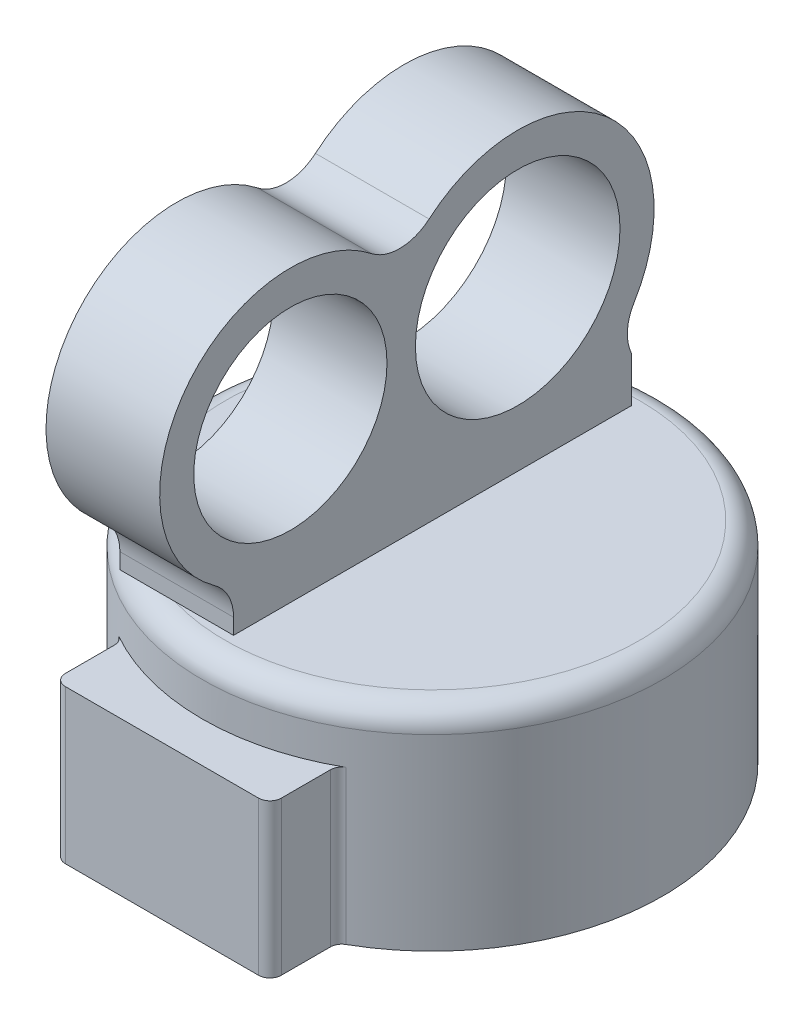
ISO-10303-21;
HEADER;
FILE_DESCRIPTION(('STEP AP214'),'2;1');
FILE_NAME('part.step','',(''),(''),'','','');
FILE_SCHEMA(('AUTOMOTIVE_DESIGN { 1 0 10303 214 1 1 1 1 }'));
ENDSEC;
DATA;
#1=APPLICATION_CONTEXT('core data for automotive mechanical design processes');
#2=APPLICATION_PROTOCOL_DEFINITION('international standard','automotive_design',2000,#1);
#3=PRODUCT_CONTEXT('',#1,'mechanical');
#4=PRODUCT('Part','Part','',(#3));
#5=PRODUCT_RELATED_PRODUCT_CATEGORY('part','',(#4));
#6=PRODUCT_DEFINITION_FORMATION('','',#4);
#7=PRODUCT_DEFINITION_CONTEXT('part definition',#1,'design');
#8=PRODUCT_DEFINITION('design','',#6,#7);
#9=PRODUCT_DEFINITION_SHAPE('','',#8);
#10=(LENGTH_UNIT() NAMED_UNIT(*) SI_UNIT(.MILLI.,.METRE.));
#11=(NAMED_UNIT(*) PLANE_ANGLE_UNIT() SI_UNIT($,.RADIAN.));
#12=(NAMED_UNIT(*) SI_UNIT($,.STERADIAN.) SOLID_ANGLE_UNIT());
#13=UNCERTAINTY_MEASURE_WITH_UNIT(LENGTH_MEASURE(1.E-05),#10,'distance_accuracy_value','');
#14=(GEOMETRIC_REPRESENTATION_CONTEXT(3) GLOBAL_UNCERTAINTY_ASSIGNED_CONTEXT((#13)) GLOBAL_UNIT_ASSIGNED_CONTEXT((#10,
#11,#12)) REPRESENTATION_CONTEXT('',''));
#15=CARTESIAN_POINT('',(0.,0.,0.));
#16=DIRECTION('',(0.,0.,1.));
#17=DIRECTION('',(1.,0.,0.));
#18=AXIS2_PLACEMENT_3D('',#15,#16,#17);
#19=CARTESIAN_POINT('',(0.,18.5,0.));
#20=DIRECTION('',(0.,-1.,0.));
#21=DIRECTION('',(0.,0.,-1.));
#22=AXIS2_PLACEMENT_3D('',#19,#20,#21);
#23=PLANE('',#22);
#24=DIRECTION('',(0.,0.,1.));
#25=VECTOR('',#24,1.);
#26=CARTESIAN_POINT('',(-10.,18.5,17.5));
#27=LINE('',#26,#25);
#28=CARTESIAN_POINT('',(-10.,18.5,-15.266384640772));
#29=VERTEX_POINT('',#28);
#30=CARTESIAN_POINT('',(-10.,18.5,15.266384640772));
#31=VERTEX_POINT('',#30);
#32=EDGE_CURVE('E298',#29,#31,#27,.T.);
#33=ORIENTED_EDGE('',*,*,#32,.F.);
#34=CARTESIAN_POINT('',(0.,18.5,0.));
#35=DIRECTION('',(0.,-1.,0.));
#36=DIRECTION('',(0.,0.,-1.));
#37=AXIS2_PLACEMENT_3D('',#34,#35,#36);
#38=CIRCLE('',#37,18.25);
#39=EDGE_CURVE('E43',#29,#31,#38,.F.);
#40=ORIENTED_EDGE('',*,*,#39,.T.);
#41=EDGE_LOOP('',(#33,#40));
#42=FACE_BOUND('',#41,.T.);
#43=ADVANCED_FACE('F35',(#42),#23,.F.);
#44=CARTESIAN_POINT('',(-10.5,0.,18.4746447868423));
#45=DIRECTION('',(0.,1.,0.));
#46=DIRECTION('',(0.,0.,1.));
#47=AXIS2_PLACEMENT_3D('',#44,#45,#46);
#48=PLANE('',#47);
#49=CARTESIAN_POINT('',(-10.5,0.,18.4746447868423));
#50=DIRECTION('',(0.,-1.,0.));
#51=DIRECTION('',(0.,0.,1.));
#52=AXIS2_PLACEMENT_3D('',#49,#50,#51);
#53=CIRCLE('',#52,1.);
#54=CARTESIAN_POINT('',(-10.0058823529412,0.,17.6052497380497));
#55=VERTEX_POINT('',#54);
#56=CARTESIAN_POINT('',(-9.5,0.,18.4746447868423));
#57=VERTEX_POINT('',#56);
#58=EDGE_CURVE('E247',#55,#57,#53,.T.);
#59=ORIENTED_EDGE('',*,*,#58,.F.);
#60=CARTESIAN_POINT('',(0.,0.,0.));
#61=DIRECTION('',(0.,1.,0.));
#62=DIRECTION('',(0.,0.,1.));
#63=AXIS2_PLACEMENT_3D('',#60,#61,#62);
#64=CIRCLE('',#63,20.25);
#65=CARTESIAN_POINT('',(10.0058823529412,0.,17.6052497380497));
#66=VERTEX_POINT('',#65);
#67=EDGE_CURVE('E268',#66,#55,#64,.T.);
#68=ORIENTED_EDGE('',*,*,#67,.F.);
#69=CARTESIAN_POINT('',(10.5,0.,18.4746447868423));
#70=DIRECTION('',(0.,-1.,0.));
#71=DIRECTION('',(0.,0.,1.));
#72=AXIS2_PLACEMENT_3D('',#69,#70,#71);
#73=CIRCLE('',#72,1.);
#74=CARTESIAN_POINT('',(9.5,0.,18.4746447868423));
#75=VERTEX_POINT('',#74);
#76=EDGE_CURVE('E265',#75,#66,#73,.T.);
#77=ORIENTED_EDGE('',*,*,#76,.F.);
#78=DIRECTION('',(0.,0.,-1.));
#79=VECTOR('',#78,1.);
#80=CARTESIAN_POINT('',(9.5,0.,22.8));
#81=LINE('',#80,#79);
#82=CARTESIAN_POINT('',(9.5,0.,22.8));
#83=VERTEX_POINT('',#82);
#84=EDGE_CURVE('E262',#83,#75,#81,.T.);
#85=ORIENTED_EDGE('',*,*,#84,.F.);
#86=CARTESIAN_POINT('',(8.5,0.,22.8));
#87=DIRECTION('',(0.,1.,0.));
#88=DIRECTION('',(0.,0.,1.));
#89=AXIS2_PLACEMENT_3D('',#86,#87,#88);
#90=CIRCLE('',#89,1.);
#91=CARTESIAN_POINT('',(8.5,0.,23.8));
#92=VERTEX_POINT('',#91);
#93=EDGE_CURVE('E259',#92,#83,#90,.T.);
#94=ORIENTED_EDGE('',*,*,#93,.F.);
#95=DIRECTION('',(1.,0.,0.));
#96=VECTOR('',#95,1.);
#97=CARTESIAN_POINT('',(8.5,0.,23.8));
#98=LINE('',#97,#96);
#99=CARTESIAN_POINT('',(-8.5,0.,23.8));
#100=VERTEX_POINT('',#99);
#101=EDGE_CURVE('E256',#100,#92,#98,.T.);
#102=ORIENTED_EDGE('',*,*,#101,.F.);
#103=CARTESIAN_POINT('',(-8.5,0.,22.8));
#104=DIRECTION('',(0.,1.,0.));
#105=DIRECTION('',(0.,0.,1.));
#106=AXIS2_PLACEMENT_3D('',#103,#104,#105);
#107=CIRCLE('',#106,1.);
#108=CARTESIAN_POINT('',(-9.5,0.,22.8));
#109=VERTEX_POINT('',#108);
#110=EDGE_CURVE('E253',#109,#100,#107,.T.);
#111=ORIENTED_EDGE('',*,*,#110,.F.);
#112=DIRECTION('',(0.,0.,1.));
#113=VECTOR('',#112,1.);
#114=CARTESIAN_POINT('',(-9.5,0.,18.4746447868423));
#115=LINE('',#114,#113);
#116=EDGE_CURVE('E250',#57,#109,#115,.T.);
#117=ORIENTED_EDGE('',*,*,#116,.F.);
#118=EDGE_LOOP('',(#59,#68,#77,#85,#94,#102,#111,#117));
#119=FACE_BOUND('',#118,.T.);
#120=ADVANCED_FACE('F336',(#119),#48,.F.);
#121=CARTESIAN_POINT('',(0.,73.3385536255682,0.));
#122=DIRECTION('',(0.,-1.,0.));
#123=DIRECTION('',(0.,0.,-1.));
#124=AXIS2_PLACEMENT_3D('',#121,#122,#123);
#125=CYLINDRICAL_SURFACE('',#124,20.25);
#126=CARTESIAN_POINT('',(0.,16.5,0.));
#127=DIRECTION('',(0.,-1.,0.));
#128=DIRECTION('',(0.,0.,-1.));
#129=AXIS2_PLACEMENT_3D('',#126,#127,#128);
#130=CIRCLE('',#129,20.25);
#131=CARTESIAN_POINT('',(0.,16.5,-20.25));
#132=VERTEX_POINT('',#131);
#133=EDGE_CURVE('E224',#132,#132,#130,.T.);
#134=ORIENTED_EDGE('',*,*,#133,.T.);
#135=EDGE_LOOP('',(#134));
#136=FACE_BOUND('',#135,.T.);
#137=DIRECTION('',(0.,-1.,0.));
#138=VECTOR('',#137,1.);
#139=CARTESIAN_POINT('',(-10.0058823529412,73.3385536255682,17.6052497380497));
#140=LINE('',#139,#138);
#141=CARTESIAN_POINT('',(-10.0058823529412,13.5,17.6052497380497));
#142=VERTEX_POINT('',#141);
#143=EDGE_CURVE('E271',#142,#55,#140,.T.);
#144=ORIENTED_EDGE('',*,*,#143,.F.);
#145=CARTESIAN_POINT('',(0.,13.5,0.));
#146=DIRECTION('',(0.,1.,0.));
#147=DIRECTION('',(0.,0.,1.));
#148=AXIS2_PLACEMENT_3D('',#145,#146,#147);
#149=CIRCLE('',#148,20.25);
#150=CARTESIAN_POINT('',(10.0058823529412,13.5,17.6052497380497));
#151=VERTEX_POINT('',#150);
#152=EDGE_CURVE('E221',#142,#151,#149,.T.);
#153=ORIENTED_EDGE('',*,*,#152,.T.);
#154=DIRECTION('',(0.,-1.,0.));
#155=VECTOR('',#154,1.);
#156=CARTESIAN_POINT('',(10.0058823529412,73.3385536255682,17.6052497380497));
#157=LINE('',#156,#155);
#158=EDGE_CURVE('E273',#151,#66,#157,.T.);
#159=ORIENTED_EDGE('',*,*,#158,.T.);
#160=ORIENTED_EDGE('',*,*,#67,.T.);
#161=EDGE_LOOP('',(#144,#153,#159,#160));
#162=FACE_BOUND('',#161,.T.);
#163=ADVANCED_FACE('F342',(#136,#162),#125,.T.);
#164=CARTESIAN_POINT('',(10.5,73.3385536255682,18.4746447868423));
#165=DIRECTION('',(0.,-1.,0.));
#166=DIRECTION('',(0.,0.,-1.));
#167=AXIS2_PLACEMENT_3D('',#164,#165,#166);
#168=CYLINDRICAL_SURFACE('',#167,1.);
#169=ORIENTED_EDGE('',*,*,#158,.F.);
#170=CARTESIAN_POINT('',(10.5,13.5,18.4746447868423));
#171=DIRECTION('',(0.,-1.,0.));
#172=DIRECTION('',(0.,0.,-1.));
#173=AXIS2_PLACEMENT_3D('',#170,#171,#172);
#174=CIRCLE('',#173,1.);
#175=CARTESIAN_POINT('',(9.5,13.5,18.4746447868423));
#176=VERTEX_POINT('',#175);
#177=EDGE_CURVE('E226',#151,#176,#174,.F.);
#178=ORIENTED_EDGE('',*,*,#177,.T.);
#179=DIRECTION('',(0.,-1.,0.));
#180=VECTOR('',#179,1.);
#181=CARTESIAN_POINT('',(9.5,73.3385536255682,18.4746447868423));
#182=LINE('',#181,#180);
#183=EDGE_CURVE('E275',#176,#75,#182,.T.);
#184=ORIENTED_EDGE('',*,*,#183,.T.);
#185=ORIENTED_EDGE('',*,*,#76,.T.);
#186=EDGE_LOOP('',(#169,#178,#184,#185));
#187=FACE_BOUND('',#186,.T.);
#188=ADVANCED_FACE('F364',(#187),#168,.F.);
#189=CARTESIAN_POINT('',(9.5,73.3385536255682,22.8));
#190=DIRECTION('',(-1.,0.,0.));
#191=DIRECTION('',(0.,0.,1.));
#192=AXIS2_PLACEMENT_3D('',#189,#190,#191);
#193=PLANE('',#192);
#194=ORIENTED_EDGE('',*,*,#183,.F.);
#195=DIRECTION('',(0.,0.,1.));
#196=VECTOR('',#195,1.);
#197=CARTESIAN_POINT('',(9.5,13.5,22.8));
#198=LINE('',#197,#196);
#199=CARTESIAN_POINT('',(9.5,13.5,22.8));
#200=VERTEX_POINT('',#199);
#201=EDGE_CURVE('E229',#176,#200,#198,.T.);
#202=ORIENTED_EDGE('',*,*,#201,.T.);
#203=DIRECTION('',(0.,-1.,0.));
#204=VECTOR('',#203,1.);
#205=CARTESIAN_POINT('',(9.5,73.3385536255682,22.8));
#206=LINE('',#205,#204);
#207=EDGE_CURVE('E277',#200,#83,#206,.T.);
#208=ORIENTED_EDGE('',*,*,#207,.T.);
#209=ORIENTED_EDGE('',*,*,#84,.T.);
#210=EDGE_LOOP('',(#194,#202,#208,#209));
#211=FACE_BOUND('',#210,.T.);
#212=ADVANCED_FACE('F367',(#211),#193,.F.);
#213=CARTESIAN_POINT('',(8.5,73.3385536255682,22.8));
#214=DIRECTION('',(0.,-1.,0.));
#215=DIRECTION('',(0.,0.,-1.));
#216=AXIS2_PLACEMENT_3D('',#213,#214,#215);
#217=CYLINDRICAL_SURFACE('',#216,1.);
#218=ORIENTED_EDGE('',*,*,#207,.F.);
#219=CARTESIAN_POINT('',(8.5,13.5,22.8));
#220=DIRECTION('',(0.,-1.,0.));
#221=DIRECTION('',(0.,0.,-1.));
#222=AXIS2_PLACEMENT_3D('',#219,#220,#221);
#223=CIRCLE('',#222,1.);
#224=CARTESIAN_POINT('',(8.5,13.5,23.8));
#225=VERTEX_POINT('',#224);
#226=EDGE_CURVE('E233',#200,#225,#223,.T.);
#227=ORIENTED_EDGE('',*,*,#226,.T.);
#228=DIRECTION('',(0.,-1.,0.));
#229=VECTOR('',#228,1.);
#230=CARTESIAN_POINT('',(8.5,73.3385536255682,23.8));
#231=LINE('',#230,#229);
#232=EDGE_CURVE('E279',#225,#92,#231,.T.);
#233=ORIENTED_EDGE('',*,*,#232,.T.);
#234=ORIENTED_EDGE('',*,*,#93,.T.);
#235=EDGE_LOOP('',(#218,#227,#233,#234));
#236=FACE_BOUND('',#235,.T.);
#237=ADVANCED_FACE('F371',(#236),#217,.T.);
#238=CARTESIAN_POINT('',(8.5,73.3385536255682,23.8));
#239=DIRECTION('',(0.,0.,-1.));
#240=DIRECTION('',(-1.,0.,0.));
#241=AXIS2_PLACEMENT_3D('',#238,#239,#240);
#242=PLANE('',#241);
#243=ORIENTED_EDGE('',*,*,#232,.F.);
#244=DIRECTION('',(-1.,0.,0.));
#245=VECTOR('',#244,1.);
#246=CARTESIAN_POINT('',(8.5,13.5,23.8));
#247=LINE('',#246,#245);
#248=CARTESIAN_POINT('',(-8.49999999999999,13.5,23.8));
#249=VERTEX_POINT('',#248);
#250=EDGE_CURVE('E236',#225,#249,#247,.T.);
#251=ORIENTED_EDGE('',*,*,#250,.T.);
#252=DIRECTION('',(0.,-1.,0.));
#253=VECTOR('',#252,1.);
#254=CARTESIAN_POINT('',(-8.5,73.3385536255682,23.8));
#255=LINE('',#254,#253);
#256=EDGE_CURVE('E281',#249,#100,#255,.T.);
#257=ORIENTED_EDGE('',*,*,#256,.T.);
#258=ORIENTED_EDGE('',*,*,#101,.T.);
#259=EDGE_LOOP('',(#243,#251,#257,#258));
#260=FACE_BOUND('',#259,.T.);
#261=ADVANCED_FACE('F375',(#260),#242,.F.);
#262=CARTESIAN_POINT('',(-8.5,73.3385536255682,22.8));
#263=DIRECTION('',(0.,-1.,0.));
#264=DIRECTION('',(0.,0.,-1.));
#265=AXIS2_PLACEMENT_3D('',#262,#263,#264);
#266=CYLINDRICAL_SURFACE('',#265,1.);
#267=ORIENTED_EDGE('',*,*,#256,.F.);
#268=CARTESIAN_POINT('',(-8.5,13.5,22.8));
#269=DIRECTION('',(0.,-1.,0.));
#270=DIRECTION('',(0.,0.,-1.));
#271=AXIS2_PLACEMENT_3D('',#268,#269,#270);
#272=CIRCLE('',#271,1.);
#273=CARTESIAN_POINT('',(-9.5,13.5,22.8));
#274=VERTEX_POINT('',#273);
#275=EDGE_CURVE('E239',#249,#274,#272,.T.);
#276=ORIENTED_EDGE('',*,*,#275,.T.);
#277=DIRECTION('',(0.,-1.,0.));
#278=VECTOR('',#277,1.);
#279=CARTESIAN_POINT('',(-9.5,73.3385536255682,22.8));
#280=LINE('',#279,#278);
#281=EDGE_CURVE('E283',#274,#109,#280,.T.);
#282=ORIENTED_EDGE('',*,*,#281,.T.);
#283=ORIENTED_EDGE('',*,*,#110,.T.);
#284=EDGE_LOOP('',(#267,#276,#282,#283));
#285=FACE_BOUND('',#284,.T.);
#286=ADVANCED_FACE('F379',(#285),#266,.T.);
#287=CARTESIAN_POINT('',(-9.5,73.3385536255682,18.4746447868423));
#288=DIRECTION('',(1.,0.,0.));
#289=DIRECTION('',(0.,0.,-1.));
#290=AXIS2_PLACEMENT_3D('',#287,#288,#289);
#291=PLANE('',#290);
#292=ORIENTED_EDGE('',*,*,#281,.F.);
#293=DIRECTION('',(0.,0.,-1.));
#294=VECTOR('',#293,1.);
#295=CARTESIAN_POINT('',(-9.5,13.5,18.4746447868423));
#296=LINE('',#295,#294);
#297=CARTESIAN_POINT('',(-9.5,13.5,18.4746447868423));
#298=VERTEX_POINT('',#297);
#299=EDGE_CURVE('E242',#274,#298,#296,.T.);
#300=ORIENTED_EDGE('',*,*,#299,.T.);
#301=DIRECTION('',(0.,-1.,0.));
#302=VECTOR('',#301,1.);
#303=CARTESIAN_POINT('',(-9.5,73.3385536255682,18.4746447868423));
#304=LINE('',#303,#302);
#305=EDGE_CURVE('E230',#298,#57,#304,.T.);
#306=ORIENTED_EDGE('',*,*,#305,.T.);
#307=ORIENTED_EDGE('',*,*,#116,.T.);
#308=EDGE_LOOP('',(#292,#300,#306,#307));
#309=FACE_BOUND('',#308,.T.);
#310=ADVANCED_FACE('F359',(#309),#291,.F.);
#311=CARTESIAN_POINT('',(-10.5,73.3385536255682,18.4746447868423));
#312=DIRECTION('',(0.,-1.,0.));
#313=DIRECTION('',(0.,0.,-1.));
#314=AXIS2_PLACEMENT_3D('',#311,#312,#313);
#315=CYLINDRICAL_SURFACE('',#314,1.);
#316=ORIENTED_EDGE('',*,*,#305,.F.);
#317=CARTESIAN_POINT('',(-10.5,13.5,18.4746447868423));
#318=DIRECTION('',(0.,-1.,0.));
#319=DIRECTION('',(0.,0.,-1.));
#320=AXIS2_PLACEMENT_3D('',#317,#318,#319);
#321=CIRCLE('',#320,1.);
#322=EDGE_CURVE('E225',#298,#142,#321,.F.);
#323=ORIENTED_EDGE('',*,*,#322,.T.);
#324=ORIENTED_EDGE('',*,*,#143,.T.);
#325=ORIENTED_EDGE('',*,*,#58,.T.);
#326=EDGE_LOOP('',(#316,#323,#324,#325));
#327=FACE_BOUND('',#326,.T.);
#328=ADVANCED_FACE('F354',(#327),#315,.F.);
#329=CARTESIAN_POINT('',(-10.,13.5,-7.5));
#330=DIRECTION('',(0.,-1.,0.));
#331=DIRECTION('',(0.,0.,-1.));
#332=AXIS2_PLACEMENT_3D('',#329,#330,#331);
#333=PLANE('',#332);
#334=ORIENTED_EDGE('',*,*,#152,.F.);
#335=ORIENTED_EDGE('',*,*,#322,.F.);
#336=ORIENTED_EDGE('',*,*,#299,.F.);
#337=ORIENTED_EDGE('',*,*,#275,.F.);
#338=ORIENTED_EDGE('',*,*,#250,.F.);
#339=ORIENTED_EDGE('',*,*,#226,.F.);
#340=ORIENTED_EDGE('',*,*,#201,.F.);
#341=ORIENTED_EDGE('',*,*,#177,.F.);
#342=EDGE_LOOP('',(#334,#335,#336,#337,#338,#339,#340,#341));
#343=FACE_BOUND('',#342,.T.);
#344=ADVANCED_FACE('F348',(#343),#333,.F.);
#345=CARTESIAN_POINT('',(-5.17807879430192,18.5,17.5));
#346=VERTEX_POINT('',#345);
#347=CARTESIAN_POINT('',(-5.17807879430199,18.5,-17.5));
#348=VERTEX_POINT('',#347);
#349=EDGE_CURVE('E44',#346,#348,#38,.F.);
#350=ORIENTED_EDGE('',*,*,#349,.T.);
#351=DIRECTION('',(1.,0.,0.));
#352=VECTOR('',#351,1.);
#353=CARTESIAN_POINT('',(-60.6779044554923,18.5,-17.5));
#354=LINE('',#353,#352);
#355=CARTESIAN_POINT('',(0.,18.5,-17.5));
#356=VERTEX_POINT('',#355);
#357=EDGE_CURVE('E56',#348,#356,#354,.T.);
#358=ORIENTED_EDGE('',*,*,#357,.T.);
#359=DIRECTION('',(0.,0.,-1.));
#360=VECTOR('',#359,1.);
#361=CARTESIAN_POINT('',(0.,18.5,17.5));
#362=LINE('',#361,#360);
#363=CARTESIAN_POINT('',(0.,18.5,17.5));
#364=VERTEX_POINT('',#363);
#365=EDGE_CURVE('E51',#364,#356,#362,.T.);
#366=ORIENTED_EDGE('',*,*,#365,.F.);
#367=DIRECTION('',(1.,0.,0.));
#368=VECTOR('',#367,1.);
#369=CARTESIAN_POINT('',(-60.6779044554923,18.5,17.5));
#370=LINE('',#369,#368);
#371=EDGE_CURVE('E205',#346,#364,#370,.T.);
#372=ORIENTED_EDGE('',*,*,#371,.F.);
#373=EDGE_LOOP('',(#350,#358,#366,#372));
#374=FACE_BOUND('',#373,.T.);
#375=ADVANCED_FACE('F338',(#374),#23,.F.);
#376=CARTESIAN_POINT('',(0.,16.5,0.));
#377=DIRECTION('',(0.,-1.,0.));
#378=DIRECTION('',(0.,0.,-1.));
#379=AXIS2_PLACEMENT_3D('',#376,#377,#378);
#380=TOROIDAL_SURFACE('',#379,18.25,2.);
#381=EDGE_CURVE('E11',#348,#29,#38,.F.);
#382=ORIENTED_EDGE('',*,*,#381,.F.);
#383=ORIENTED_EDGE('',*,*,#349,.F.);
#384=EDGE_CURVE('E288',#31,#346,#38,.F.);
#385=ORIENTED_EDGE('',*,*,#384,.F.);
#386=ORIENTED_EDGE('',*,*,#39,.F.);
#387=EDGE_LOOP('',(#382,#383,#385,#386));
#388=FACE_BOUND('',#387,.T.);
#389=ORIENTED_EDGE('',*,*,#133,.F.);
#390=EDGE_LOOP('',(#389));
#391=FACE_BOUND('',#390,.T.);
#392=ADVANCED_FACE('F37',(#388,#391),#380,.T.);
#393=CARTESIAN_POINT('',(-60.6779044554923,18.5,17.5));
#394=DIRECTION('',(0.,-1.,0.));
#395=DIRECTION('',(0.,0.,-1.));
#396=AXIS2_PLACEMENT_3D('',#393,#394,#395);
#397=PLANE('',#396);
#398=CARTESIAN_POINT('',(-10.,18.5,-17.5));
#399=VERTEX_POINT('',#398);
#400=EDGE_CURVE('E171',#399,#348,#354,.T.);
#401=ORIENTED_EDGE('',*,*,#400,.T.);
#402=ORIENTED_EDGE('',*,*,#381,.T.);
#403=EDGE_CURVE('E306',#399,#29,#27,.T.);
#404=ORIENTED_EDGE('',*,*,#403,.F.);
#405=EDGE_LOOP('',(#401,#402,#404));
#406=FACE_BOUND('',#405,.T.);
#407=ADVANCED_FACE('F353',(#406),#397,.T.);
#408=CARTESIAN_POINT('',(-60.6779044554923,18.5,-17.5));
#409=DIRECTION('',(0.,0.,-1.));
#410=DIRECTION('',(-1.,0.,0.));
#411=AXIS2_PLACEMENT_3D('',#408,#409,#410);
#412=PLANE('',#411);
#413=DIRECTION('',(0.,-1.,0.));
#414=VECTOR('',#413,1.);
#415=CARTESIAN_POINT('',(-10.,18.5,-17.5));
#416=LINE('',#415,#414);
#417=CARTESIAN_POINT('',(-10.,22.5,-17.5));
#418=VERTEX_POINT('',#417);
#419=EDGE_CURVE('E167',#418,#399,#416,.T.);
#420=ORIENTED_EDGE('',*,*,#419,.F.);
#421=DIRECTION('',(1.,0.,0.));
#422=VECTOR('',#421,1.);
#423=CARTESIAN_POINT('',(-60.6779044554923,22.5,-17.5));
#424=LINE('',#423,#422);
#425=CARTESIAN_POINT('',(0.,22.5,-17.5));
#426=VERTEX_POINT('',#425);
#427=EDGE_CURVE('E161',#418,#426,#424,.T.);
#428=ORIENTED_EDGE('',*,*,#427,.T.);
#429=DIRECTION('',(0.,1.,0.));
#430=VECTOR('',#429,1.);
#431=CARTESIAN_POINT('',(0.,18.5,-17.5));
#432=LINE('',#431,#430);
#433=EDGE_CURVE('E165',#356,#426,#432,.T.);
#434=ORIENTED_EDGE('',*,*,#433,.F.);
#435=ORIENTED_EDGE('',*,*,#357,.F.);
#436=ORIENTED_EDGE('',*,*,#400,.F.);
#437=EDGE_LOOP('',(#420,#428,#434,#435,#436));
#438=FACE_BOUND('',#437,.T.);
#439=ADVANCED_FACE('F163',(#438),#412,.T.);
#440=CARTESIAN_POINT('',(-60.6779044554923,24.1457513110646,-21.1457513110646));
#441=DIRECTION('',(1.,0.,0.));
#442=DIRECTION('',(0.,0.,-1.));
#443=AXIS2_PLACEMENT_3D('',#440,#441,#442);
#444=CYLINDRICAL_SURFACE('',#443,4.);
#445=CARTESIAN_POINT('',(-10.,24.1457513110646,-21.1457513110646));
#446=DIRECTION('',(1.,0.,0.));
#447=DIRECTION('',(0.,0.,-1.));
#448=AXIS2_PLACEMENT_3D('',#445,#446,#447);
#449=CIRCLE('',#448,4.);
#450=CARTESIAN_POINT('',(-10.,26.2343134832984,-17.7343134832984));
#451=VERTEX_POINT('',#450);
#452=EDGE_CURVE('E204',#451,#418,#449,.T.);
#453=ORIENTED_EDGE('',*,*,#452,.F.);
#454=DIRECTION('',(1.,0.,0.));
#455=VECTOR('',#454,1.);
#456=CARTESIAN_POINT('',(-60.6779044554923,26.2343134832984,-17.7343134832984));
#457=LINE('',#456,#455);
#458=CARTESIAN_POINT('',(0.,26.2343134832984,-17.7343134832984));
#459=VERTEX_POINT('',#458);
#460=EDGE_CURVE('E170',#451,#459,#457,.T.);
#461=ORIENTED_EDGE('',*,*,#460,.T.);
#462=CARTESIAN_POINT('',(0.,24.1457513110646,-21.1457513110646));
#463=DIRECTION('',(-1.,0.,0.));
#464=DIRECTION('',(0.,0.,-1.));
#465=AXIS2_PLACEMENT_3D('',#462,#463,#464);
#466=CIRCLE('',#465,4.);
#467=EDGE_CURVE('E174',#426,#459,#466,.T.);
#468=ORIENTED_EDGE('',*,*,#467,.F.);
#469=ORIENTED_EDGE('',*,*,#427,.F.);
#470=EDGE_LOOP('',(#453,#461,#468,#469));
#471=FACE_BOUND('',#470,.T.);
#472=ADVANCED_FACE('F175',(#471),#444,.F.);
#473=CARTESIAN_POINT('',(-60.6779044554923,32.5,-7.49999999999999));
#474=DIRECTION('',(1.,0.,0.));
#475=DIRECTION('',(0.,0.,-1.));
#476=AXIS2_PLACEMENT_3D('',#473,#474,#475);
#477=CYLINDRICAL_SURFACE('',#476,12.);
#478=CARTESIAN_POINT('',(-10.,32.5,-7.49999999999999));
#479=DIRECTION('',(1.,0.,0.));
#480=DIRECTION('',(0.,0.,-1.));
#481=AXIS2_PLACEMENT_3D('',#478,#479,#480);
#482=CIRCLE('',#481,12.);
#483=CARTESIAN_POINT('',(-10.,41.6232178000607,0.295312500000001));
#484=VERTEX_POINT('',#483);
#485=EDGE_CURVE('E554',#484,#451,#482,.F.);
#486=ORIENTED_EDGE('',*,*,#485,.F.);
#487=DIRECTION('',(1.,0.,0.));
#488=VECTOR('',#487,1.);
#489=CARTESIAN_POINT('',(-60.6779044554923,41.6232178000607,0.2953125));
#490=LINE('',#489,#488);
#491=CARTESIAN_POINT('',(0.,41.6232178000607,0.2953125));
#492=VERTEX_POINT('',#491);
#493=EDGE_CURVE('E212',#484,#492,#490,.T.);
#494=ORIENTED_EDGE('',*,*,#493,.T.);
#495=CARTESIAN_POINT('',(0.,32.5,-7.49999999999999));
#496=DIRECTION('',(1.,0.,0.));
#497=DIRECTION('',(0.,0.,-1.));
#498=AXIS2_PLACEMENT_3D('',#495,#496,#497);
#499=CIRCLE('',#498,12.);
#500=EDGE_CURVE('E180',#459,#492,#499,.T.);
#501=ORIENTED_EDGE('',*,*,#500,.F.);
#502=ORIENTED_EDGE('',*,*,#460,.F.);
#503=EDGE_LOOP('',(#486,#494,#501,#502));
#504=FACE_BOUND('',#503,.T.);
#505=ADVANCED_FACE('F461',(#504),#477,.T.);
#506=CARTESIAN_POINT('',(-60.6779044554923,44.6642904000809,2.89375000000001));
#507=DIRECTION('',(1.,0.,0.));
#508=DIRECTION('',(0.,0.,-1.));
#509=AXIS2_PLACEMENT_3D('',#506,#507,#508);
#510=CYLINDRICAL_SURFACE('',#509,4.);
#511=CARTESIAN_POINT('',(-10.,44.6642904000809,2.89375000000001));
#512=DIRECTION('',(1.,0.,0.));
#513=DIRECTION('',(0.,0.,-1.));
#514=AXIS2_PLACEMENT_3D('',#511,#512,#513);
#515=CIRCLE('',#514,4.);
#516=CARTESIAN_POINT('',(-10.,41.525118683931,5.37278225806452));
#517=VERTEX_POINT('',#516);
#518=EDGE_CURVE('E550',#517,#484,#515,.T.);
#519=ORIENTED_EDGE('',*,*,#518,.F.);
#520=DIRECTION('',(1.,0.,0.));
#521=VECTOR('',#520,1.);
#522=CARTESIAN_POINT('',(-60.6779044554923,41.525118683931,5.37278225806452));
#523=LINE('',#522,#521);
#524=CARTESIAN_POINT('',(0.,41.525118683931,5.37278225806452));
#525=VERTEX_POINT('',#524);
#526=EDGE_CURVE('E210',#517,#525,#523,.T.);
#527=ORIENTED_EDGE('',*,*,#526,.T.);
#528=CARTESIAN_POINT('',(0.,44.6642904000809,2.89375000000001));
#529=DIRECTION('',(-1.,0.,0.));
#530=DIRECTION('',(0.,0.,-1.));
#531=AXIS2_PLACEMENT_3D('',#528,#529,#530);
#532=CIRCLE('',#531,4.);
#533=EDGE_CURVE('E190',#492,#525,#532,.T.);
#534=ORIENTED_EDGE('',*,*,#533,.F.);
#535=ORIENTED_EDGE('',*,*,#493,.F.);
#536=EDGE_LOOP('',(#519,#527,#534,#535));
#537=FACE_BOUND('',#536,.T.);
#538=ADVANCED_FACE('F470',(#537),#510,.F.);
#539=CARTESIAN_POINT('',(-60.6779044554923,32.5,12.5));
#540=DIRECTION('',(1.,0.,0.));
#541=DIRECTION('',(0.,0.,-1.));
#542=AXIS2_PLACEMENT_3D('',#539,#540,#541);
#543=CYLINDRICAL_SURFACE('',#542,11.5);
#544=CARTESIAN_POINT('',(-10.,32.5,12.5));
#545=DIRECTION('',(1.,0.,0.));
#546=DIRECTION('',(0.,0.,-1.));
#547=AXIS2_PLACEMENT_3D('',#544,#545,#546);
#548=CIRCLE('',#547,11.5);
#549=CARTESIAN_POINT('',(-10.,23.1371974943596,19.1774193548387));
#550=VERTEX_POINT('',#549);
#551=EDGE_CURVE('E548',#550,#517,#548,.F.);
#552=ORIENTED_EDGE('',*,*,#551,.F.);
#553=DIRECTION('',(1.,0.,0.));
#554=VECTOR('',#553,1.);
#555=CARTESIAN_POINT('',(-60.6779044554923,23.1371974943596,19.1774193548387));
#556=LINE('',#555,#554);
#557=CARTESIAN_POINT('',(0.,23.1371974943596,19.1774193548387));
#558=VERTEX_POINT('',#557);
#559=EDGE_CURVE('E208',#550,#558,#556,.T.);
#560=ORIENTED_EDGE('',*,*,#559,.T.);
#561=CARTESIAN_POINT('',(0.,32.5,12.5));
#562=DIRECTION('',(1.,0.,0.));
#563=DIRECTION('',(0.,0.,-1.));
#564=AXIS2_PLACEMENT_3D('',#561,#562,#563);
#565=CIRCLE('',#564,11.5);
#566=EDGE_CURVE('E193',#525,#558,#565,.T.);
#567=ORIENTED_EDGE('',*,*,#566,.F.);
#568=ORIENTED_EDGE('',*,*,#526,.F.);
#569=EDGE_LOOP('',(#552,#560,#567,#568));
#570=FACE_BOUND('',#569,.T.);
#571=ADVANCED_FACE('F480',(#570),#543,.T.);
#572=CARTESIAN_POINT('',(-60.6779044554923,19.880570535876,21.5));
#573=DIRECTION('',(1.,0.,0.));
#574=DIRECTION('',(0.,0.,-1.));
#575=AXIS2_PLACEMENT_3D('',#572,#573,#574);
#576=CYLINDRICAL_SURFACE('',#575,4.);
#577=CARTESIAN_POINT('',(-10.,19.880570535876,21.5));
#578=DIRECTION('',(1.,0.,0.));
#579=DIRECTION('',(0.,0.,-1.));
#580=AXIS2_PLACEMENT_3D('',#577,#578,#579);
#581=CIRCLE('',#580,4.);
#582=CARTESIAN_POINT('',(-10.,19.880570535876,17.5));
#583=VERTEX_POINT('',#582);
#584=EDGE_CURVE('E547',#583,#550,#581,.T.);
#585=ORIENTED_EDGE('',*,*,#584,.F.);
#586=DIRECTION('',(1.,0.,0.));
#587=VECTOR('',#586,1.);
#588=CARTESIAN_POINT('',(-60.6779044554923,19.880570535876,17.5));
#589=LINE('',#588,#587);
#590=CARTESIAN_POINT('',(0.,19.880570535876,17.5));
#591=VERTEX_POINT('',#590);
#592=EDGE_CURVE('E206',#583,#591,#589,.T.);
#593=ORIENTED_EDGE('',*,*,#592,.T.);
#594=CARTESIAN_POINT('',(0.,19.880570535876,21.5));
#595=DIRECTION('',(-1.,0.,0.));
#596=DIRECTION('',(0.,0.,-1.));
#597=AXIS2_PLACEMENT_3D('',#594,#595,#596);
#598=CIRCLE('',#597,4.);
#599=EDGE_CURVE('E196',#558,#591,#598,.T.);
#600=ORIENTED_EDGE('',*,*,#599,.F.);
#601=ORIENTED_EDGE('',*,*,#559,.F.);
#602=EDGE_LOOP('',(#585,#593,#600,#601));
#603=FACE_BOUND('',#602,.T.);
#604=ADVANCED_FACE('F490',(#603),#576,.F.);
#605=CARTESIAN_POINT('',(-60.6779044554923,19.880570535876,17.5));
#606=DIRECTION('',(0.,0.,1.));
#607=DIRECTION('',(1.,0.,0.));
#608=AXIS2_PLACEMENT_3D('',#605,#606,#607);
#609=PLANE('',#608);
#610=DIRECTION('',(0.,1.,0.));
#611=VECTOR('',#610,1.);
#612=CARTESIAN_POINT('',(-10.,19.880570535876,17.5));
#613=LINE('',#612,#611);
#614=CARTESIAN_POINT('',(-10.,18.5,17.5));
#615=VERTEX_POINT('',#614);
#616=EDGE_CURVE('E304',#615,#583,#613,.T.);
#617=ORIENTED_EDGE('',*,*,#616,.F.);
#618=EDGE_CURVE('E201',#615,#346,#370,.T.);
#619=ORIENTED_EDGE('',*,*,#618,.T.);
#620=ORIENTED_EDGE('',*,*,#371,.T.);
#621=DIRECTION('',(0.,-1.,0.));
#622=VECTOR('',#621,1.);
#623=CARTESIAN_POINT('',(0.,19.880570535876,17.5));
#624=LINE('',#623,#622);
#625=EDGE_CURVE('E199',#591,#364,#624,.T.);
#626=ORIENTED_EDGE('',*,*,#625,.F.);
#627=ORIENTED_EDGE('',*,*,#592,.F.);
#628=EDGE_LOOP('',(#617,#619,#620,#626,#627));
#629=FACE_BOUND('',#628,.T.);
#630=ADVANCED_FACE('F500',(#629),#609,.T.);
#631=EDGE_CURVE('E300',#31,#615,#27,.T.);
#632=ORIENTED_EDGE('',*,*,#631,.F.);
#633=ORIENTED_EDGE('',*,*,#384,.T.);
#634=ORIENTED_EDGE('',*,*,#618,.F.);
#635=EDGE_LOOP('',(#632,#633,#634));
#636=FACE_BOUND('',#635,.T.);
#637=ADVANCED_FACE('F301',(#636),#397,.T.);
#638=CARTESIAN_POINT('',(-60.6779044554923,32.5,-7.49999999999999));
#639=DIRECTION('',(1.,0.,0.));
#640=DIRECTION('',(0.,0.,-1.));
#641=AXIS2_PLACEMENT_3D('',#638,#639,#640);
#642=CYLINDRICAL_SURFACE('',#641,9.);
#643=CARTESIAN_POINT('',(-10.,32.5,-7.49999999999999));
#644=DIRECTION('',(1.,0.,0.));
#645=DIRECTION('',(0.,0.,-1.));
#646=AXIS2_PLACEMENT_3D('',#643,#644,#645);
#647=CIRCLE('',#646,9.);
#648=CARTESIAN_POINT('',(-10.,32.5,-16.5));
#649=VERTEX_POINT('',#648);
#650=EDGE_CURVE('E220',#649,#649,#647,.F.);
#651=ORIENTED_EDGE('',*,*,#650,.T.);
#652=EDGE_LOOP('',(#651));
#653=FACE_BOUND('',#652,.T.);
#654=CARTESIAN_POINT('',(0.,32.5,-7.49999999999999));
#655=DIRECTION('',(1.,0.,0.));
#656=DIRECTION('',(0.,0.,-1.));
#657=AXIS2_PLACEMENT_3D('',#654,#655,#656);
#658=CIRCLE('',#657,9.);
#659=CARTESIAN_POINT('',(0.,32.5,-16.5));
#660=VERTEX_POINT('',#659);
#661=EDGE_CURVE('E185',#660,#660,#658,.T.);
#662=ORIENTED_EDGE('',*,*,#661,.T.);
#663=EDGE_LOOP('',(#662));
#664=FACE_BOUND('',#663,.T.);
#665=ADVANCED_FACE('F319',(#653,#664),#642,.F.);
#666=CARTESIAN_POINT('',(0.,24.1457513110646,-21.1457513110646));
#667=DIRECTION('',(1.,0.,0.));
#668=DIRECTION('',(0.,0.,-1.));
#669=AXIS2_PLACEMENT_3D('',#666,#667,#668);
#670=PLANE('',#669);
#671=CARTESIAN_POINT('',(0.,32.5,12.5));
#672=DIRECTION('',(1.,0.,0.));
#673=DIRECTION('',(0.,0.,-1.));
#674=AXIS2_PLACEMENT_3D('',#671,#672,#673);
#675=CIRCLE('',#674,8.5);
#676=CARTESIAN_POINT('',(0.,32.5,4.00000000000001));
#677=VERTEX_POINT('',#676);
#678=EDGE_CURVE('E314',#677,#677,#675,.T.);
#679=ORIENTED_EDGE('',*,*,#678,.F.);
#680=EDGE_LOOP('',(#679));
#681=FACE_BOUND('',#680,.T.);
#682=ORIENTED_EDGE('',*,*,#661,.F.);
#683=EDGE_LOOP('',(#682));
#684=FACE_BOUND('',#683,.T.);
#685=ORIENTED_EDGE('',*,*,#365,.T.);
#686=ORIENTED_EDGE('',*,*,#433,.T.);
#687=ORIENTED_EDGE('',*,*,#467,.T.);
#688=ORIENTED_EDGE('',*,*,#500,.T.);
#689=ORIENTED_EDGE('',*,*,#533,.T.);
#690=ORIENTED_EDGE('',*,*,#566,.T.);
#691=ORIENTED_EDGE('',*,*,#599,.T.);
#692=ORIENTED_EDGE('',*,*,#625,.T.);
#693=EDGE_LOOP('',(#685,#686,#687,#688,#689,#690,#691,#692));
#694=FACE_BOUND('',#693,.T.);
#695=ADVANCED_FACE('F182',(#681,#684,#694),#670,.T.);
#696=CARTESIAN_POINT('',(-60.6779044554923,32.5,12.5));
#697=DIRECTION('',(1.,0.,0.));
#698=DIRECTION('',(0.,0.,-1.));
#699=AXIS2_PLACEMENT_3D('',#696,#697,#698);
#700=CYLINDRICAL_SURFACE('',#699,8.5);
#701=CARTESIAN_POINT('',(-10.,32.5,12.5));
#702=DIRECTION('',(1.,0.,0.));
#703=DIRECTION('',(0.,0.,-1.));
#704=AXIS2_PLACEMENT_3D('',#701,#702,#703);
#705=CIRCLE('',#704,8.5);
#706=CARTESIAN_POINT('',(-10.,32.5,4.00000000000001));
#707=VERTEX_POINT('',#706);
#708=EDGE_CURVE('E217',#707,#707,#705,.F.);
#709=ORIENTED_EDGE('',*,*,#708,.T.);
#710=EDGE_LOOP('',(#709));
#711=FACE_BOUND('',#710,.T.);
#712=ORIENTED_EDGE('',*,*,#678,.T.);
#713=EDGE_LOOP('',(#712));
#714=FACE_BOUND('',#713,.T.);
#715=ADVANCED_FACE('F322',(#711,#714),#700,.F.);
#716=CARTESIAN_POINT('',(-10.,32.5,-7.49999999999999));
#717=DIRECTION('',(1.,0.,0.));
#718=DIRECTION('',(0.,0.,1.));
#719=AXIS2_PLACEMENT_3D('',#716,#717,#718);
#720=PLANE('',#719);
#721=ORIENTED_EDGE('',*,*,#403,.T.);
#722=ORIENTED_EDGE('',*,*,#32,.T.);
#723=ORIENTED_EDGE('',*,*,#631,.T.);
#724=ORIENTED_EDGE('',*,*,#616,.T.);
#725=ORIENTED_EDGE('',*,*,#584,.T.);
#726=ORIENTED_EDGE('',*,*,#551,.T.);
#727=ORIENTED_EDGE('',*,*,#518,.T.);
#728=ORIENTED_EDGE('',*,*,#485,.T.);
#729=ORIENTED_EDGE('',*,*,#452,.T.);
#730=ORIENTED_EDGE('',*,*,#419,.T.);
#731=EDGE_LOOP('',(#721,#722,#723,#724,#725,#726,#727,#728,#729,#730));
#732=FACE_BOUND('',#731,.T.);
#733=ORIENTED_EDGE('',*,*,#708,.F.);
#734=EDGE_LOOP('',(#733));
#735=FACE_BOUND('',#734,.T.);
#736=ORIENTED_EDGE('',*,*,#650,.F.);
#737=EDGE_LOOP('',(#736));
#738=FACE_BOUND('',#737,.T.);
#739=ADVANCED_FACE('F308',(#732,#735,#738),#720,.F.);
#740=CLOSED_SHELL('',(#43,#120,#163,#188,#212,#237,#261,#286,#310,#328,#344,#375,#392,#407,#439,
#472,#505,#538,#571,#604,#630,#637,#665,#695,#715,#739));
#741=MANIFOLD_SOLID_BREP('B2',#740);
#742=ADVANCED_BREP_SHAPE_REPRESENTATION('',(#18,#741),#14);
#743=SHAPE_DEFINITION_REPRESENTATION(#9,#742);
ENDSEC;
END-ISO-10303-21;
